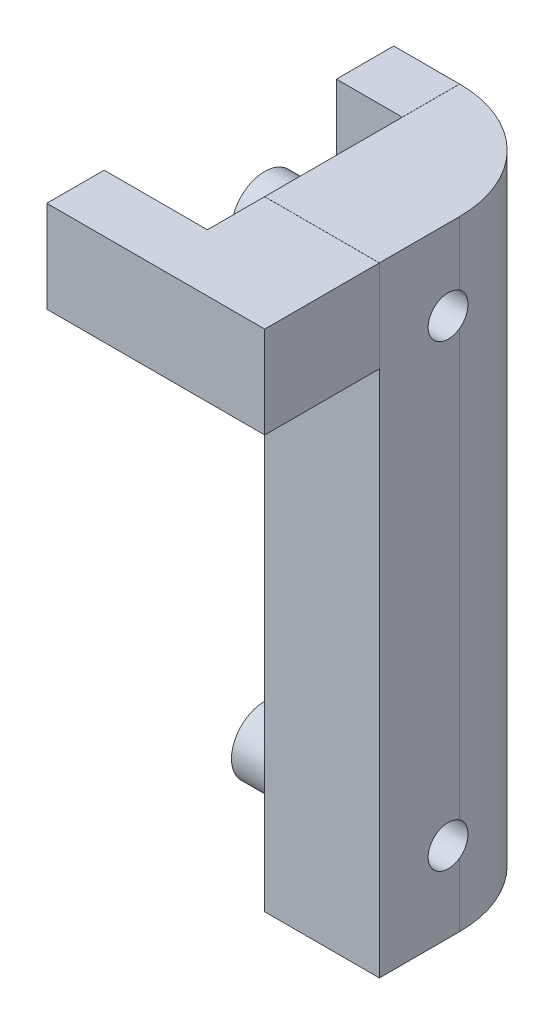
ISO-10303-21;
HEADER;
FILE_DESCRIPTION(('STEP AP214'),'2;1');
FILE_NAME('part.step','',(''),(''),'','','');
FILE_SCHEMA(('AUTOMOTIVE_DESIGN { 1 0 10303 214 1 1 1 1 }'));
ENDSEC;
DATA;
#1=APPLICATION_CONTEXT('core data for automotive mechanical design processes');
#2=APPLICATION_PROTOCOL_DEFINITION('international standard','automotive_design',2000,#1);
#3=PRODUCT_CONTEXT('',#1,'mechanical');
#4=PRODUCT('Part','Part','',(#3));
#5=PRODUCT_RELATED_PRODUCT_CATEGORY('part','',(#4));
#6=PRODUCT_DEFINITION_FORMATION('','',#4);
#7=PRODUCT_DEFINITION_CONTEXT('part definition',#1,'design');
#8=PRODUCT_DEFINITION('design','',#6,#7);
#9=PRODUCT_DEFINITION_SHAPE('','',#8);
#10=(LENGTH_UNIT() NAMED_UNIT(*) SI_UNIT(.MILLI.,.METRE.));
#11=(NAMED_UNIT(*) PLANE_ANGLE_UNIT() SI_UNIT($,.RADIAN.));
#12=(NAMED_UNIT(*) SI_UNIT($,.STERADIAN.) SOLID_ANGLE_UNIT());
#13=UNCERTAINTY_MEASURE_WITH_UNIT(LENGTH_MEASURE(1.E-05),#10,'distance_accuracy_value','');
#14=(GEOMETRIC_REPRESENTATION_CONTEXT(3) GLOBAL_UNCERTAINTY_ASSIGNED_CONTEXT((#13)) GLOBAL_UNIT_ASSIGNED_CONTEXT((#10,
#11,#12)) REPRESENTATION_CONTEXT('',''));
#15=CARTESIAN_POINT('',(0.,0.,0.));
#16=DIRECTION('',(0.,0.,1.));
#17=DIRECTION('',(1.,0.,0.));
#18=AXIS2_PLACEMENT_3D('',#15,#16,#17);
#19=CARTESIAN_POINT('',(0.,0.,-12.));
#20=DIRECTION('',(0.,0.,-1.));
#21=DIRECTION('',(-1.,0.,0.));
#22=AXIS2_PLACEMENT_3D('',#19,#20,#21);
#23=PLANE('',#22);
#24=DIRECTION('',(0.,1.,0.));
#25=VECTOR('',#24,1.);
#26=CARTESIAN_POINT('',(-5.74999999999999,0.,-12.));
#27=LINE('',#26,#25);
#28=CARTESIAN_POINT('',(-5.74999999999999,39.,-12.));
#29=VERTEX_POINT('',#28);
#30=CARTESIAN_POINT('',(-5.74999999999999,54.,-12.));
#31=VERTEX_POINT('',#30);
#32=EDGE_CURVE('E87',#29,#31,#27,.T.);
#33=ORIENTED_EDGE('',*,*,#32,.F.);
#34=DIRECTION('',(1.,0.,0.));
#35=VECTOR('',#34,1.);
#36=CARTESIAN_POINT('',(0.,39.,-12.));
#37=LINE('',#36,#35);
#38=CARTESIAN_POINT('',(-4.74999999999999,39.,-12.));
#39=VERTEX_POINT('',#38);
#40=EDGE_CURVE('E126',#29,#39,#37,.T.);
#41=ORIENTED_EDGE('',*,*,#40,.T.);
#42=DIRECTION('',(0.0843655685135238,0.996434870349984,0.));
#43=VECTOR('',#42,1.);
#44=CARTESIAN_POINT('',(-7.99471862016185,0.676892189911727,-12.));
#45=LINE('',#44,#43);
#46=CARTESIAN_POINT('',(-4.41253772594589,42.9857394813999,-12.));
#47=VERTEX_POINT('',#46);
#48=EDGE_CURVE('E154',#39,#47,#45,.T.);
#49=ORIENTED_EDGE('',*,*,#48,.T.);
#50=DIRECTION('',(1.,0.,0.));
#51=VECTOR('',#50,1.);
#52=CARTESIAN_POINT('',(0.,42.9857394813999,-12.));
#53=LINE('',#52,#51);
#54=CARTESIAN_POINT('',(-2.41253772594589,42.9857394813999,-12.));
#55=VERTEX_POINT('',#54);
#56=EDGE_CURVE('E151',#47,#55,#53,.T.);
#57=ORIENTED_EDGE('',*,*,#56,.T.);
#58=DIRECTION('',(0.259301975602914,-0.965796296041989,0.));
#59=VECTOR('',#58,1.);
#60=CARTESIAN_POINT('',(8.5147181781846,2.28607549475352,-12.));
#61=LINE('',#60,#59);
#62=CARTESIAN_POINT('',(-0.00999999999999612,34.0372460060821,-12.));
#63=VERTEX_POINT('',#62);
#64=EDGE_CURVE('E119',#55,#63,#61,.T.);
#65=ORIENTED_EDGE('',*,*,#64,.T.);
#66=DIRECTION('',(0.,-1.,0.));
#67=VECTOR('',#66,1.);
#68=CARTESIAN_POINT('',(-0.01,0.,-12.));
#69=LINE('',#68,#67);
#70=CARTESIAN_POINT('',(-0.01,54.,-12.));
#71=VERTEX_POINT('',#70);
#72=EDGE_CURVE('E49',#71,#63,#69,.T.);
#73=ORIENTED_EDGE('',*,*,#72,.F.);
#74=DIRECTION('',(1.,0.,0.));
#75=VECTOR('',#74,1.);
#76=CARTESIAN_POINT('',(10.,54.,-12.));
#77=LINE('',#76,#75);
#78=EDGE_CURVE('E101',#31,#71,#77,.T.);
#79=ORIENTED_EDGE('',*,*,#78,.F.);
#80=EDGE_LOOP('',(#33,#41,#49,#57,#65,#73,#79));
#81=FACE_BOUND('',#80,.T.);
#82=ADVANCED_FACE('F46',(#81),#23,.F.);
#83=CARTESIAN_POINT('',(0.,0.,-17.));
#84=DIRECTION('',(0.,0.,-1.));
#85=DIRECTION('',(-1.,0.,0.));
#86=AXIS2_PLACEMENT_3D('',#83,#84,#85);
#87=PLANE('',#86);
#88=DIRECTION('',(1.,0.,0.));
#89=VECTOR('',#88,1.);
#90=CARTESIAN_POINT('',(0.,39.,-17.));
#91=LINE('',#90,#89);
#92=CARTESIAN_POINT('',(-5.74999999999999,39.,-17.));
#93=VERTEX_POINT('',#92);
#94=CARTESIAN_POINT('',(-4.74999999999999,39.,-17.));
#95=VERTEX_POINT('',#94);
#96=EDGE_CURVE('E123',#93,#95,#91,.T.);
#97=ORIENTED_EDGE('',*,*,#96,.F.);
#98=DIRECTION('',(0.,1.,0.));
#99=VECTOR('',#98,1.);
#100=CARTESIAN_POINT('',(-5.74999999999999,0.,-17.));
#101=LINE('',#100,#99);
#102=CARTESIAN_POINT('',(-5.74999999999999,54.,-17.));
#103=VERTEX_POINT('',#102);
#104=EDGE_CURVE('E112',#93,#103,#101,.T.);
#105=ORIENTED_EDGE('',*,*,#104,.T.);
#106=DIRECTION('',(1.,0.,0.));
#107=VECTOR('',#106,1.);
#108=CARTESIAN_POINT('',(10.,54.,-17.));
#109=LINE('',#108,#107);
#110=CARTESIAN_POINT('',(-0.01,54.,-17.));
#111=VERTEX_POINT('',#110);
#112=EDGE_CURVE('E118',#103,#111,#109,.T.);
#113=ORIENTED_EDGE('',*,*,#112,.T.);
#114=DIRECTION('',(0.,1.,0.));
#115=VECTOR('',#114,1.);
#116=CARTESIAN_POINT('',(-0.01,0.,-17.));
#117=LINE('',#116,#115);
#118=CARTESIAN_POINT('',(-0.01,34.0372460060822,-17.));
#119=VERTEX_POINT('',#118);
#120=EDGE_CURVE('E143',#119,#111,#117,.T.);
#121=ORIENTED_EDGE('',*,*,#120,.F.);
#122=DIRECTION('',(0.259301975602914,-0.965796296041989,0.));
#123=VECTOR('',#122,1.);
#124=CARTESIAN_POINT('',(8.5147181781846,2.28607549475352,-17.));
#125=LINE('',#124,#123);
#126=CARTESIAN_POINT('',(-2.41253772594589,42.9857394813999,-17.));
#127=VERTEX_POINT('',#126);
#128=EDGE_CURVE('E12',#127,#119,#125,.T.);
#129=ORIENTED_EDGE('',*,*,#128,.F.);
#130=DIRECTION('',(1.,0.,0.));
#131=VECTOR('',#130,1.);
#132=CARTESIAN_POINT('',(0.,42.9857394813999,-17.));
#133=LINE('',#132,#131);
#134=CARTESIAN_POINT('',(-4.41253772594589,42.9857394813999,-17.));
#135=VERTEX_POINT('',#134);
#136=EDGE_CURVE('E140',#135,#127,#133,.T.);
#137=ORIENTED_EDGE('',*,*,#136,.F.);
#138=DIRECTION('',(0.0843655685135238,0.996434870349984,0.));
#139=VECTOR('',#138,1.);
#140=CARTESIAN_POINT('',(-7.99471862016185,0.676892189911727,-17.));
#141=LINE('',#140,#139);
#142=EDGE_CURVE('E132',#95,#135,#141,.T.);
#143=ORIENTED_EDGE('',*,*,#142,.F.);
#144=EDGE_LOOP('',(#97,#105,#113,#121,#129,#137,#143));
#145=FACE_BOUND('',#144,.T.);
#146=ADVANCED_FACE('F130',(#145),#87,.T.);
#147=CARTESIAN_POINT('',(10.,54.,0.));
#148=DIRECTION('',(0.,-1.,0.));
#149=DIRECTION('',(0.,0.,-1.));
#150=AXIS2_PLACEMENT_3D('',#147,#148,#149);
#151=PLANE('',#150);
#152=DIRECTION('',(0.,0.,1.));
#153=VECTOR('',#152,1.);
#154=CARTESIAN_POINT('',(-5.74999999999999,54.,-27.));
#155=LINE('',#154,#153);
#156=EDGE_CURVE('E114',#103,#31,#155,.T.);
#157=ORIENTED_EDGE('',*,*,#156,.T.);
#158=ORIENTED_EDGE('',*,*,#78,.T.);
#159=DIRECTION('',(0.,0.,1.));
#160=VECTOR('',#159,1.);
#161=CARTESIAN_POINT('',(-0.01,54.,-24.5));
#162=LINE('',#161,#160);
#163=EDGE_CURVE('E127',#111,#71,#162,.T.);
#164=ORIENTED_EDGE('',*,*,#163,.F.);
#165=ORIENTED_EDGE('',*,*,#112,.F.);
#166=EDGE_LOOP('',(#157,#158,#164,#165));
#167=FACE_BOUND('',#166,.T.);
#168=ADVANCED_FACE('F164',(#167),#151,.F.);
#169=CARTESIAN_POINT('',(-0.01,0.,-24.5));
#170=DIRECTION('',(-1.,0.,0.));
#171=DIRECTION('',(0.,-1.,0.));
#172=AXIS2_PLACEMENT_3D('',#169,#170,#171);
#173=PLANE('',#172);
#174=ORIENTED_EDGE('',*,*,#72,.T.);
#175=DIRECTION('',(0.,0.,-1.));
#176=VECTOR('',#175,1.);
#177=CARTESIAN_POINT('',(-0.01,34.0372460060822,-24.5));
#178=LINE('',#177,#176);
#179=EDGE_CURVE('E63',#63,#119,#178,.T.);
#180=ORIENTED_EDGE('',*,*,#179,.T.);
#181=ORIENTED_EDGE('',*,*,#120,.T.);
#182=ORIENTED_EDGE('',*,*,#163,.T.);
#183=EDGE_LOOP('',(#174,#180,#181,#182));
#184=FACE_BOUND('',#183,.T.);
#185=ADVANCED_FACE('F161',(#184),#173,.F.);
#186=CARTESIAN_POINT('',(-5.74999999999999,0.,-27.));
#187=DIRECTION('',(-1.,0.,0.));
#188=DIRECTION('',(0.,-1.,0.));
#189=AXIS2_PLACEMENT_3D('',#186,#187,#188);
#190=PLANE('',#189);
#191=DIRECTION('',(0.,0.,1.));
#192=VECTOR('',#191,1.);
#193=CARTESIAN_POINT('',(-5.74999999999999,39.,-27.));
#194=LINE('',#193,#192);
#195=EDGE_CURVE('E93',#93,#29,#194,.T.);
#196=ORIENTED_EDGE('',*,*,#195,.T.);
#197=ORIENTED_EDGE('',*,*,#32,.T.);
#198=ORIENTED_EDGE('',*,*,#156,.F.);
#199=ORIENTED_EDGE('',*,*,#104,.F.);
#200=EDGE_LOOP('',(#196,#197,#198,#199));
#201=FACE_BOUND('',#200,.T.);
#202=ADVANCED_FACE('F113',(#201),#190,.T.);
#203=CARTESIAN_POINT('',(0.,39.,-27.));
#204=DIRECTION('',(0.,1.,0.));
#205=DIRECTION('',(0.,0.,1.));
#206=AXIS2_PLACEMENT_3D('',#203,#204,#205);
#207=PLANE('',#206);
#208=ORIENTED_EDGE('',*,*,#96,.T.);
#209=DIRECTION('',(0.,0.,1.));
#210=VECTOR('',#209,1.);
#211=CARTESIAN_POINT('',(-4.74999999999999,39.,-27.));
#212=LINE('',#211,#210);
#213=EDGE_CURVE('E133',#95,#39,#212,.T.);
#214=ORIENTED_EDGE('',*,*,#213,.T.);
#215=ORIENTED_EDGE('',*,*,#40,.F.);
#216=ORIENTED_EDGE('',*,*,#195,.F.);
#217=EDGE_LOOP('',(#208,#214,#215,#216));
#218=FACE_BOUND('',#217,.T.);
#219=ADVANCED_FACE('F122',(#218),#207,.F.);
#220=CARTESIAN_POINT('',(-7.99471862016185,0.676892189911727,-27.));
#221=DIRECTION('',(-0.996434870349984,0.0843655685135238,0.));
#222=DIRECTION('',(-0.0843655685135238,-0.996434870349984,0.));
#223=AXIS2_PLACEMENT_3D('',#220,#221,#222);
#224=PLANE('',#223);
#225=ORIENTED_EDGE('',*,*,#142,.T.);
#226=DIRECTION('',(0.,0.,1.));
#227=VECTOR('',#226,1.);
#228=CARTESIAN_POINT('',(-4.41253772594589,42.9857394813999,-27.));
#229=LINE('',#228,#227);
#230=EDGE_CURVE('E139',#135,#47,#229,.T.);
#231=ORIENTED_EDGE('',*,*,#230,.T.);
#232=ORIENTED_EDGE('',*,*,#48,.F.);
#233=ORIENTED_EDGE('',*,*,#213,.F.);
#234=EDGE_LOOP('',(#225,#231,#232,#233));
#235=FACE_BOUND('',#234,.T.);
#236=ADVANCED_FACE('F174',(#235),#224,.F.);
#237=CARTESIAN_POINT('',(0.,42.9857394813999,-27.));
#238=DIRECTION('',(0.,1.,0.));
#239=DIRECTION('',(0.,0.,1.));
#240=AXIS2_PLACEMENT_3D('',#237,#238,#239);
#241=PLANE('',#240);
#242=ORIENTED_EDGE('',*,*,#136,.T.);
#243=DIRECTION('',(0.,0.,1.));
#244=VECTOR('',#243,1.);
#245=CARTESIAN_POINT('',(-2.41253772594589,42.9857394813999,-27.));
#246=LINE('',#245,#244);
#247=EDGE_CURVE('E55',#127,#55,#246,.T.);
#248=ORIENTED_EDGE('',*,*,#247,.T.);
#249=ORIENTED_EDGE('',*,*,#56,.F.);
#250=ORIENTED_EDGE('',*,*,#230,.F.);
#251=EDGE_LOOP('',(#242,#248,#249,#250));
#252=FACE_BOUND('',#251,.T.);
#253=ADVANCED_FACE('F171',(#252),#241,.F.);
#254=CARTESIAN_POINT('',(8.5147181781846,2.28607549475352,-27.));
#255=DIRECTION('',(0.965796296041989,0.259301975602914,0.));
#256=DIRECTION('',(-0.259301975602914,0.965796296041989,0.));
#257=AXIS2_PLACEMENT_3D('',#254,#255,#256);
#258=PLANE('',#257);
#259=ORIENTED_EDGE('',*,*,#128,.T.);
#260=ORIENTED_EDGE('',*,*,#179,.F.);
#261=ORIENTED_EDGE('',*,*,#64,.F.);
#262=ORIENTED_EDGE('',*,*,#247,.F.);
#263=EDGE_LOOP('',(#259,#260,#261,#262));
#264=FACE_BOUND('',#263,.T.);
#265=ADVANCED_FACE('F168',(#264),#258,.F.);
#266=CLOSED_SHELL('',(#82,#146,#168,#185,#202,#219,#236,#253,#265));
#267=MANIFOLD_SOLID_BREP('B2',#266);
#268=CARTESIAN_POINT('',(-6.,0.,3.));
#269=DIRECTION('',(-1.,0.,0.));
#270=DIRECTION('',(0.,0.,1.));
#271=AXIS2_PLACEMENT_3D('',#268,#269,#270);
#272=PLANE('',#271);
#273=CARTESIAN_POINT('',(-6.,47.,-6.));
#274=DIRECTION('',(-1.,0.,0.));
#275=DIRECTION('',(0.,0.,1.));
#276=AXIS2_PLACEMENT_3D('',#273,#274,#275);
#277=CIRCLE('',#276,1.75);
#278=CARTESIAN_POINT('',(-6.,47.,-4.25));
#279=VERTEX_POINT('',#278);
#280=EDGE_CURVE('E439',#279,#279,#277,.F.);
#281=ORIENTED_EDGE('',*,*,#280,.T.);
#282=EDGE_LOOP('',(#281));
#283=FACE_BOUND('',#282,.T.);
#284=CARTESIAN_POINT('',(-6.,47.,-6.));
#285=DIRECTION('',(-1.,0.,0.));
#286=DIRECTION('',(0.,0.,1.));
#287=AXIS2_PLACEMENT_3D('',#284,#285,#286);
#288=CIRCLE('',#287,2.9);
#289=CARTESIAN_POINT('',(-6.,47.,-3.1));
#290=VERTEX_POINT('',#289);
#291=EDGE_CURVE('E389',#290,#290,#288,.T.);
#292=ORIENTED_EDGE('',*,*,#291,.T.);
#293=EDGE_LOOP('',(#292));
#294=FACE_BOUND('',#293,.T.);
#295=ADVANCED_FACE('F273',(#283,#294),#272,.T.);
#296=CARTESIAN_POINT('',(-6.,7.,-6.));
#297=DIRECTION('',(-1.,0.,0.));
#298=DIRECTION('',(0.,0.,1.));
#299=AXIS2_PLACEMENT_3D('',#296,#297,#298);
#300=CIRCLE('',#299,1.75);
#301=CARTESIAN_POINT('',(-6.,7.,-4.25));
#302=VERTEX_POINT('',#301);
#303=EDGE_CURVE('E443',#302,#302,#300,.F.);
#304=ORIENTED_EDGE('',*,*,#303,.T.);
#305=EDGE_LOOP('',(#304));
#306=FACE_BOUND('',#305,.T.);
#307=CARTESIAN_POINT('',(-6.,7.,-6.));
#308=DIRECTION('',(-1.,0.,0.));
#309=DIRECTION('',(0.,0.,1.));
#310=AXIS2_PLACEMENT_3D('',#307,#308,#309);
#311=CIRCLE('',#310,2.9);
#312=CARTESIAN_POINT('',(-6.,7.,-3.1));
#313=VERTEX_POINT('',#312);
#314=EDGE_CURVE('E395',#313,#313,#311,.T.);
#315=ORIENTED_EDGE('',*,*,#314,.T.);
#316=EDGE_LOOP('',(#315));
#317=FACE_BOUND('',#316,.T.);
#318=ADVANCED_FACE('F421',(#306,#317),#272,.T.);
#319=CARTESIAN_POINT('',(-18.,47.,-6.));
#320=DIRECTION('',(1.,0.,0.));
#321=DIRECTION('',(0.,0.,-1.));
#322=AXIS2_PLACEMENT_3D('',#319,#320,#321);
#323=CYLINDRICAL_SURFACE('',#322,2.9);
#324=CARTESIAN_POINT('',(0.,47.,-6.));
#325=DIRECTION('',(-1.,0.,0.));
#326=DIRECTION('',(0.,0.,1.));
#327=AXIS2_PLACEMENT_3D('',#324,#325,#326);
#328=CIRCLE('',#327,2.9);
#329=CARTESIAN_POINT('',(0.,47.,-3.1));
#330=VERTEX_POINT('',#329);
#331=EDGE_CURVE('E385',#330,#330,#328,.T.);
#332=ORIENTED_EDGE('',*,*,#331,.T.);
#333=EDGE_LOOP('',(#332));
#334=FACE_BOUND('',#333,.T.);
#335=ORIENTED_EDGE('',*,*,#291,.F.);
#336=EDGE_LOOP('',(#335));
#337=FACE_BOUND('',#336,.T.);
#338=ADVANCED_FACE('F418',(#334,#337),#323,.T.);
#339=CARTESIAN_POINT('',(-18.,7.,-6.));
#340=DIRECTION('',(1.,0.,0.));
#341=DIRECTION('',(0.,0.,-1.));
#342=AXIS2_PLACEMENT_3D('',#339,#340,#341);
#343=CYLINDRICAL_SURFACE('',#342,2.9);
#344=CARTESIAN_POINT('',(0.,7.,-6.));
#345=DIRECTION('',(-1.,0.,0.));
#346=DIRECTION('',(0.,0.,1.));
#347=AXIS2_PLACEMENT_3D('',#344,#345,#346);
#348=CIRCLE('',#347,2.9);
#349=CARTESIAN_POINT('',(0.,7.,-3.1));
#350=VERTEX_POINT('',#349);
#351=EDGE_CURVE('E381',#350,#350,#348,.T.);
#352=ORIENTED_EDGE('',*,*,#351,.T.);
#353=EDGE_LOOP('',(#352));
#354=FACE_BOUND('',#353,.T.);
#355=ORIENTED_EDGE('',*,*,#314,.F.);
#356=EDGE_LOOP('',(#355));
#357=FACE_BOUND('',#356,.T.);
#358=ADVANCED_FACE('F410',(#354,#357),#343,.T.);
#359=CARTESIAN_POINT('',(-40.,47.,-6.));
#360=DIRECTION('',(1.,0.,0.));
#361=DIRECTION('',(0.,0.,-1.));
#362=AXIS2_PLACEMENT_3D('',#359,#360,#361);
#363=CYLINDRICAL_SURFACE('',#362,1.75);
#364=CARTESIAN_POINT('',(10.,47.,-6.));
#365=DIRECTION('',(1.,0.,0.));
#366=DIRECTION('',(0.,0.,-1.));
#367=AXIS2_PLACEMENT_3D('',#364,#365,#366);
#368=CIRCLE('',#367,1.75);
#369=CARTESIAN_POINT('',(10.,48.4361406616345,-7.));
#370=VERTEX_POINT('',#369);
#371=CARTESIAN_POINT('',(10.,45.5638593383655,-7.));
#372=VERTEX_POINT('',#371);
#373=EDGE_CURVE('E378',#370,#372,#368,.T.);
#374=ORIENTED_EDGE('',*,*,#373,.T.);
#375=CARTESIAN_POINT('',(10.,45.5638593383655,-7.));
#376=CARTESIAN_POINT('',(10.0000006542808,45.5919650566019,-7.04036344551534));
#377=CARTESIAN_POINT('',(9.99975552912993,45.6217592461802,-7.07952147261429));
#378=CARTESIAN_POINT('',(9.99886721788507,45.6845302019363,-7.15518733666776));
#379=CARTESIAN_POINT('',(9.99822406551166,45.7175066983116,-7.19169539783292));
#380=CARTESIAN_POINT('',(9.99584030617024,45.820813513358,-7.29678148084108));
#381=CARTESIAN_POINT('',(9.99364478898106,45.8956139153034,-7.36105431872777));
#382=CARTESIAN_POINT('',(9.98882544239522,46.054906829154,-7.47613351277805));
#383=CARTESIAN_POINT('',(9.98620147105636,46.1394025502455,-7.52693539147472));
#384=CARTESIAN_POINT('',(9.98124809723654,46.3157152869494,-7.61365995107846));
#385=CARTESIAN_POINT('',(9.97891863903286,46.4075309122384,-7.64958544957473));
#386=CARTESIAN_POINT('',(9.97511636825516,46.5960599022418,-7.7055850033634));
#387=CARTESIAN_POINT('',(9.97364500693632,46.6927812652959,-7.72563222492341));
#388=CARTESIAN_POINT('',(9.97190260333323,46.8882438337843,-7.74920014978107));
#389=CARTESIAN_POINT('',(9.97163173501098,46.9869853298711,-7.75271845789818));
#390=CARTESIAN_POINT('',(9.97235055566954,47.1833831704782,-7.74313260307863));
#391=CARTESIAN_POINT('',(9.97333683064026,47.2810417305433,-7.73007345973699));
#392=CARTESIAN_POINT('',(9.9763417454006,47.4727742133054,-7.68778574199415));
#393=CARTESIAN_POINT('',(9.97836035839059,47.5668482289894,-7.65855758734069));
#394=CARTESIAN_POINT('',(9.98295739974431,47.7488299782278,-7.58474179248768));
#395=CARTESIAN_POINT('',(9.98553628681202,47.8367325806732,-7.54014154929976));
#396=CARTESIAN_POINT('',(9.99058725724228,48.0038095791689,-7.43683755119579));
#397=CARTESIAN_POINT('',(9.99305938180665,48.082987360944,-7.37813929542403));
#398=CARTESIAN_POINT('',(9.99654582384383,48.2093309081838,-7.2668664717303));
#399=CARTESIAN_POINT('',(9.99777482009432,48.2591883227644,-7.21731558560462));
#400=CARTESIAN_POINT('',(9.9995029589419,48.3525603899018,-7.11265622577304));
#401=CARTESIAN_POINT('',(10.0000029676914,48.396082514322,-7.05755443082301));
#402=CARTESIAN_POINT('',(10.,48.4361406616345,-7.));
#403=B_SPLINE_CURVE_WITH_KNOTS('',3,(#375,#376,#377,#378,#379,#380,#381,#382,#383,#384,#385,
#386,#387,#388,#389,#390,#391,#392,#393,#394,#395,#396,#397,#398,#399,#400,#401,#402),
.UNSPECIFIED.,.F.,.F.,(4,2,2,2,2,2,2,2,2,2,2,2,2,4),(0.,0.147461941238161,0.294911391308664,
0.589330258085857,0.883846861260627,1.17830765739356,1.4732650264693,1.76826513606561,
2.06246582135381,2.35665886954673,2.6510936913996,2.94541385046185,3.15584019967012,
3.36601632476801),.UNSPECIFIED.);
#404=EDGE_CURVE('E373',#372,#370,#403,.T.);
#405=ORIENTED_EDGE('',*,*,#404,.T.);
#406=EDGE_LOOP('',(#374,#405));
#407=FACE_BOUND('',#406,.T.);
#408=ORIENTED_EDGE('',*,*,#280,.F.);
#409=EDGE_LOOP('',(#408));
#410=FACE_BOUND('',#409,.T.);
#411=ADVANCED_FACE('F405',(#407,#410),#363,.F.);
#412=CARTESIAN_POINT('',(-40.,7.,-6.));
#413=DIRECTION('',(1.,0.,0.));
#414=DIRECTION('',(0.,0.,-1.));
#415=AXIS2_PLACEMENT_3D('',#412,#413,#414);
#416=CYLINDRICAL_SURFACE('',#415,1.75);
#417=CARTESIAN_POINT('',(10.,7.,-6.));
#418=DIRECTION('',(1.,0.,0.));
#419=DIRECTION('',(0.,0.,-1.));
#420=AXIS2_PLACEMENT_3D('',#417,#418,#419);
#421=CIRCLE('',#420,1.75);
#422=CARTESIAN_POINT('',(10.,8.43614066163451,-7.));
#423=VERTEX_POINT('',#422);
#424=CARTESIAN_POINT('',(10.,5.56385933836549,-7.));
#425=VERTEX_POINT('',#424);
#426=EDGE_CURVE('E383',#423,#425,#421,.T.);
#427=ORIENTED_EDGE('',*,*,#426,.T.);
#428=CARTESIAN_POINT('',(10.,5.56385933836549,-7.));
#429=CARTESIAN_POINT('',(10.0000006542808,5.59196505660189,-7.04036344551534));
#430=CARTESIAN_POINT('',(9.99975552912993,5.62175924618019,-7.07952147261429));
#431=CARTESIAN_POINT('',(9.99886721788507,5.68453020193636,-7.15518733666776));
#432=CARTESIAN_POINT('',(9.99822406551166,5.71750669831157,-7.19169539783292));
#433=CARTESIAN_POINT('',(9.99584030617024,5.82081351335797,-7.29678148084108));
#434=CARTESIAN_POINT('',(9.99364478898106,5.89561391530344,-7.36105431872777));
#435=CARTESIAN_POINT('',(9.98882544239522,6.05490682915403,-7.47613351277805));
#436=CARTESIAN_POINT('',(9.98620147105636,6.13940255024554,-7.52693539147472));
#437=CARTESIAN_POINT('',(9.98124809723654,6.31571528694942,-7.61365995107846));
#438=CARTESIAN_POINT('',(9.97891863903286,6.40753091223844,-7.64958544957473));
#439=CARTESIAN_POINT('',(9.97511636825516,6.59605990224182,-7.7055850033634));
#440=CARTESIAN_POINT('',(9.97364500693632,6.69278126529587,-7.72563222492341));
#441=CARTESIAN_POINT('',(9.97190260333323,6.88824383378427,-7.74920014978107));
#442=CARTESIAN_POINT('',(9.97163173501098,6.98698532987111,-7.75271845789817));
#443=CARTESIAN_POINT('',(9.97235055566953,7.18338317047819,-7.74313260307863));
#444=CARTESIAN_POINT('',(9.97333683064026,7.28104173054331,-7.73007345973699));
#445=CARTESIAN_POINT('',(9.9763417454006,7.47277421330537,-7.68778574199415));
#446=CARTESIAN_POINT('',(9.9783603583906,7.56684822898936,-7.65855758734069));
#447=CARTESIAN_POINT('',(9.98295739974431,7.74882997822776,-7.58474179248768));
#448=CARTESIAN_POINT('',(9.98553628681202,7.83673258067322,-7.54014154929976));
#449=CARTESIAN_POINT('',(9.99058725724228,8.00380957916886,-7.43683755119579));
#450=CARTESIAN_POINT('',(9.99305938180665,8.08298736094404,-7.37813929542403));
#451=CARTESIAN_POINT('',(9.99654582384383,8.20933090818378,-7.2668664717303));
#452=CARTESIAN_POINT('',(9.99777482009432,8.25918832276443,-7.21731558560462));
#453=CARTESIAN_POINT('',(9.9995029589419,8.35256038990176,-7.11265622577305));
#454=CARTESIAN_POINT('',(10.0000029676914,8.39608251432201,-7.05755443082301));
#455=CARTESIAN_POINT('',(10.,8.43614066163451,-7.));
#456=B_SPLINE_CURVE_WITH_KNOTS('',3,(#428,#429,#430,#431,#432,#433,#434,#435,#436,#437,#438,
#439,#440,#441,#442,#443,#444,#445,#446,#447,#448,#449,#450,#451,#452,#453,#454,#455),
.UNSPECIFIED.,.F.,.F.,(4,2,2,2,2,2,2,2,2,2,2,2,2,4),(0.,0.147461941238167,0.294911391308668,
0.589330258085854,0.883846861260628,1.17830765739354,1.4732650264693,1.7682651360656,
2.06246582135381,2.35665886954672,2.65109369139959,2.94541385046184,3.15584019967011,
3.36601632476801),.UNSPECIFIED.);
#457=EDGE_CURVE('E331',#425,#423,#456,.T.);
#458=ORIENTED_EDGE('',*,*,#457,.T.);
#459=EDGE_LOOP('',(#427,#458));
#460=FACE_BOUND('',#459,.T.);
#461=ORIENTED_EDGE('',*,*,#303,.F.);
#462=EDGE_LOOP('',(#461));
#463=FACE_BOUND('',#462,.T.);
#464=ADVANCED_FACE('F409',(#460,#463),#416,.F.);
#465=CARTESIAN_POINT('',(0.,0.,-7.));
#466=DIRECTION('',(0.,1.,0.));
#467=DIRECTION('',(0.,0.,1.));
#468=AXIS2_PLACEMENT_3D('',#465,#466,#467);
#469=CYLINDRICAL_SURFACE('',#468,10.);
#470=ORIENTED_EDGE('',*,*,#457,.F.);
#471=DIRECTION('',(0.,-1.,0.));
#472=VECTOR('',#471,1.);
#473=CARTESIAN_POINT('',(10.,54.,-7.));
#474=LINE('',#473,#472);
#475=CARTESIAN_POINT('',(10.,0.,-7.));
#476=VERTEX_POINT('',#475);
#477=EDGE_CURVE('E346',#476,#425,#474,.F.);
#478=ORIENTED_EDGE('',*,*,#477,.F.);
#479=CARTESIAN_POINT('',(0.,0.,-7.));
#480=DIRECTION('',(0.,1.,0.));
#481=DIRECTION('',(0.,0.,1.));
#482=AXIS2_PLACEMENT_3D('',#479,#480,#481);
#483=CIRCLE('',#482,10.);
#484=CARTESIAN_POINT('',(0.,0.,-17.));
#485=VERTEX_POINT('',#484);
#486=EDGE_CURVE('E327',#485,#476,#483,.F.);
#487=ORIENTED_EDGE('',*,*,#486,.F.);
#488=DIRECTION('',(0.,-1.,0.));
#489=VECTOR('',#488,1.);
#490=CARTESIAN_POINT('',(0.,0.,-17.));
#491=LINE('',#490,#489);
#492=CARTESIAN_POINT('',(0.,54.,-17.));
#493=VERTEX_POINT('',#492);
#494=EDGE_CURVE('E334',#493,#485,#491,.T.);
#495=ORIENTED_EDGE('',*,*,#494,.F.);
#496=CARTESIAN_POINT('',(0.,54.,-7.));
#497=DIRECTION('',(0.,-1.,0.));
#498=DIRECTION('',(0.,0.,-1.));
#499=AXIS2_PLACEMENT_3D('',#496,#497,#498);
#500=CIRCLE('',#499,10.);
#501=CARTESIAN_POINT('',(10.,54.,-7.));
#502=VERTEX_POINT('',#501);
#503=EDGE_CURVE('E44',#502,#493,#500,.F.);
#504=ORIENTED_EDGE('',*,*,#503,.F.);
#505=DIRECTION('',(0.,-1.,0.));
#506=VECTOR('',#505,1.);
#507=CARTESIAN_POINT('',(10.,54.,-7.));
#508=LINE('',#507,#506);
#509=EDGE_CURVE('E341',#370,#502,#508,.F.);
#510=ORIENTED_EDGE('',*,*,#509,.F.);
#511=ORIENTED_EDGE('',*,*,#404,.F.);
#512=DIRECTION('',(0.,-1.,0.));
#513=VECTOR('',#512,1.);
#514=CARTESIAN_POINT('',(10.,54.,-7.));
#515=LINE('',#514,#513);
#516=EDGE_CURVE('E360',#423,#372,#515,.F.);
#517=ORIENTED_EDGE('',*,*,#516,.F.);
#518=EDGE_LOOP('',(#470,#478,#487,#495,#504,#510,#511,#517));
#519=FACE_BOUND('',#518,.T.);
#520=ADVANCED_FACE('F345',(#519),#469,.T.);
#521=CARTESIAN_POINT('',(10.,0.,0.));
#522=DIRECTION('',(0.,1.,0.));
#523=DIRECTION('',(0.,0.,1.));
#524=AXIS2_PLACEMENT_3D('',#521,#522,#523);
#525=PLANE('',#524);
#526=DIRECTION('',(0.,0.,-1.));
#527=VECTOR('',#526,1.);
#528=CARTESIAN_POINT('',(0.,0.,0.));
#529=LINE('',#528,#527);
#530=CARTESIAN_POINT('',(0.,0.,0.));
#531=VERTEX_POINT('',#530);
#532=EDGE_CURVE('E322',#531,#485,#529,.T.);
#533=ORIENTED_EDGE('',*,*,#532,.T.);
#534=ORIENTED_EDGE('',*,*,#486,.T.);
#535=DIRECTION('',(0.,0.,-1.));
#536=VECTOR('',#535,1.);
#537=CARTESIAN_POINT('',(10.,0.,0.));
#538=LINE('',#537,#536);
#539=CARTESIAN_POINT('',(10.,0.,0.));
#540=VERTEX_POINT('',#539);
#541=EDGE_CURVE('E363',#540,#476,#538,.T.);
#542=ORIENTED_EDGE('',*,*,#541,.F.);
#543=DIRECTION('',(-1.,0.,0.));
#544=VECTOR('',#543,1.);
#545=CARTESIAN_POINT('',(10.,0.,0.));
#546=LINE('',#545,#544);
#547=EDGE_CURVE('E330',#540,#531,#546,.T.);
#548=ORIENTED_EDGE('',*,*,#547,.T.);
#549=EDGE_LOOP('',(#533,#534,#542,#548));
#550=FACE_BOUND('',#549,.T.);
#551=ADVANCED_FACE('F324',(#550),#525,.F.);
#552=CARTESIAN_POINT('',(10.,0.,0.));
#553=DIRECTION('',(0.,0.,-1.));
#554=DIRECTION('',(-1.,0.,0.));
#555=AXIS2_PLACEMENT_3D('',#552,#553,#554);
#556=PLANE('',#555);
#557=ORIENTED_EDGE('',*,*,#547,.F.);
#558=DIRECTION('',(0.,-1.,0.));
#559=VECTOR('',#558,1.);
#560=CARTESIAN_POINT('',(10.,96.,0.));
#561=LINE('',#560,#559);
#562=CARTESIAN_POINT('',(10.,54.,0.));
#563=VERTEX_POINT('',#562);
#564=EDGE_CURVE('E367',#563,#540,#561,.T.);
#565=ORIENTED_EDGE('',*,*,#564,.F.);
#566=DIRECTION('',(1.,0.,0.));
#567=VECTOR('',#566,1.);
#568=CARTESIAN_POINT('',(10.,54.,0.));
#569=LINE('',#568,#567);
#570=CARTESIAN_POINT('',(0.,54.,0.));
#571=VERTEX_POINT('',#570);
#572=EDGE_CURVE('E364',#571,#563,#569,.T.);
#573=ORIENTED_EDGE('',*,*,#572,.F.);
#574=DIRECTION('',(0.,-1.,0.));
#575=VECTOR('',#574,1.);
#576=CARTESIAN_POINT('',(0.,0.,0.));
#577=LINE('',#576,#575);
#578=EDGE_CURVE('E289',#571,#531,#577,.T.);
#579=ORIENTED_EDGE('',*,*,#578,.T.);
#580=EDGE_LOOP('',(#557,#565,#573,#579));
#581=FACE_BOUND('',#580,.T.);
#582=ADVANCED_FACE('F423',(#581),#556,.F.);
#583=CARTESIAN_POINT('',(10.,46.,0.));
#584=DIRECTION('',(1.,0.,0.));
#585=DIRECTION('',(0.,0.,-1.));
#586=AXIS2_PLACEMENT_3D('',#583,#584,#585);
#587=PLANE('',#586);
#588=ORIENTED_EDGE('',*,*,#564,.T.);
#589=ORIENTED_EDGE('',*,*,#541,.T.);
#590=ORIENTED_EDGE('',*,*,#477,.T.);
#591=ORIENTED_EDGE('',*,*,#426,.F.);
#592=ORIENTED_EDGE('',*,*,#516,.T.);
#593=ORIENTED_EDGE('',*,*,#373,.F.);
#594=ORIENTED_EDGE('',*,*,#509,.T.);
#595=DIRECTION('',(0.,0.,-1.));
#596=VECTOR('',#595,1.);
#597=CARTESIAN_POINT('',(10.,54.,0.));
#598=LINE('',#597,#596);
#599=EDGE_CURVE('E277',#563,#502,#598,.T.);
#600=ORIENTED_EDGE('',*,*,#599,.F.);
#601=EDGE_LOOP('',(#588,#589,#590,#591,#592,#593,#594,#600));
#602=FACE_BOUND('',#601,.T.);
#603=ADVANCED_FACE('F376',(#602),#587,.T.);
#604=CARTESIAN_POINT('',(0.,46.,5.));
#605=DIRECTION('',(-1.,0.,0.));
#606=DIRECTION('',(0.,0.,1.));
#607=AXIS2_PLACEMENT_3D('',#604,#605,#606);
#608=PLANE('',#607);
#609=ORIENTED_EDGE('',*,*,#578,.F.);
#610=DIRECTION('',(0.,0.,1.));
#611=VECTOR('',#610,1.);
#612=CARTESIAN_POINT('',(0.,54.,5.));
#613=LINE('',#612,#611);
#614=EDGE_CURVE('E338',#493,#571,#613,.T.);
#615=ORIENTED_EDGE('',*,*,#614,.F.);
#616=ORIENTED_EDGE('',*,*,#494,.T.);
#617=ORIENTED_EDGE('',*,*,#532,.F.);
#618=EDGE_LOOP('',(#609,#615,#616,#617));
#619=FACE_BOUND('',#618,.T.);
#620=ORIENTED_EDGE('',*,*,#351,.F.);
#621=EDGE_LOOP('',(#620));
#622=FACE_BOUND('',#621,.T.);
#623=ORIENTED_EDGE('',*,*,#331,.F.);
#624=EDGE_LOOP('',(#623));
#625=FACE_BOUND('',#624,.T.);
#626=ADVANCED_FACE('F335',(#619,#622,#625),#608,.T.);
#627=CARTESIAN_POINT('',(10.,54.,0.));
#628=DIRECTION('',(0.,-1.,0.));
#629=DIRECTION('',(0.,0.,-1.));
#630=AXIS2_PLACEMENT_3D('',#627,#628,#629);
#631=PLANE('',#630);
#632=ORIENTED_EDGE('',*,*,#614,.T.);
#633=ORIENTED_EDGE('',*,*,#572,.T.);
#634=ORIENTED_EDGE('',*,*,#599,.T.);
#635=ORIENTED_EDGE('',*,*,#503,.T.);
#636=EDGE_LOOP('',(#632,#633,#634,#635));
#637=FACE_BOUND('',#636,.T.);
#638=ADVANCED_FACE('F275',(#637),#631,.F.);
#639=CLOSED_SHELL('',(#295,#318,#338,#358,#411,#464,#520,#551,#582,#603,#626,#638));
#640=MANIFOLD_SOLID_BREP('B6',#639);
#641=CARTESIAN_POINT('',(-18.,46.,5.));
#642=DIRECTION('',(0.,0.,-1.));
#643=DIRECTION('',(-1.,0.,0.));
#644=AXIS2_PLACEMENT_3D('',#641,#642,#643);
#645=PLANE('',#644);
#646=DIRECTION('',(0.,-1.,0.));
#647=VECTOR('',#646,1.);
#648=CARTESIAN_POINT('',(-9.,46.,5.));
#649=LINE('',#648,#647);
#650=CARTESIAN_POINT('',(-9.,54.,5.));
#651=VERTEX_POINT('',#650);
#652=CARTESIAN_POINT('',(-9.,46.,5.));
#653=VERTEX_POINT('',#652);
#654=EDGE_CURVE('E626',#651,#653,#649,.T.);
#655=ORIENTED_EDGE('',*,*,#654,.F.);
#656=DIRECTION('',(-1.,0.,0.));
#657=VECTOR('',#656,1.);
#658=CARTESIAN_POINT('',(-18.,54.,5.));
#659=LINE('',#658,#657);
#660=CARTESIAN_POINT('',(0.,54.,5.));
#661=VERTEX_POINT('',#660);
#662=EDGE_CURVE('E638',#661,#651,#659,.T.);
#663=ORIENTED_EDGE('',*,*,#662,.F.);
#664=DIRECTION('',(0.,1.,0.));
#665=VECTOR('',#664,1.);
#666=CARTESIAN_POINT('',(0.,46.,5.));
#667=LINE('',#666,#665);
#668=CARTESIAN_POINT('',(0.,46.,5.));
#669=VERTEX_POINT('',#668);
#670=EDGE_CURVE('E580',#669,#661,#667,.T.);
#671=ORIENTED_EDGE('',*,*,#670,.F.);
#672=DIRECTION('',(-1.,0.,0.));
#673=VECTOR('',#672,1.);
#674=CARTESIAN_POINT('',(-18.,46.,5.));
#675=LINE('',#674,#673);
#676=EDGE_CURVE('E640',#669,#653,#675,.T.);
#677=ORIENTED_EDGE('',*,*,#676,.T.);
#678=EDGE_LOOP('',(#655,#663,#671,#677));
#679=FACE_BOUND('',#678,.T.);
#680=ADVANCED_FACE('F571',(#679),#645,.T.);
#681=CARTESIAN_POINT('',(10.,46.,10.));
#682=DIRECTION('',(0.,0.,1.));
#683=DIRECTION('',(1.,0.,0.));
#684=AXIS2_PLACEMENT_3D('',#681,#682,#683);
#685=PLANE('',#684);
#686=DIRECTION('',(0.,1.,0.));
#687=VECTOR('',#686,1.);
#688=CARTESIAN_POINT('',(-8.99999999999999,46.,10.));
#689=LINE('',#688,#687);
#690=CARTESIAN_POINT('',(-9.,46.,10.));
#691=VERTEX_POINT('',#690);
#692=CARTESIAN_POINT('',(-8.99999999999999,54.,10.));
#693=VERTEX_POINT('',#692);
#694=EDGE_CURVE('E588',#691,#693,#689,.T.);
#695=ORIENTED_EDGE('',*,*,#694,.F.);
#696=DIRECTION('',(1.,0.,0.));
#697=VECTOR('',#696,1.);
#698=CARTESIAN_POINT('',(10.,46.,10.));
#699=LINE('',#698,#697);
#700=CARTESIAN_POINT('',(10.,46.,10.));
#701=VERTEX_POINT('',#700);
#702=EDGE_CURVE('E647',#691,#701,#699,.T.);
#703=ORIENTED_EDGE('',*,*,#702,.T.);
#704=DIRECTION('',(0.,1.,0.));
#705=VECTOR('',#704,1.);
#706=CARTESIAN_POINT('',(10.,46.,10.));
#707=LINE('',#706,#705);
#708=CARTESIAN_POINT('',(10.,54.,10.));
#709=VERTEX_POINT('',#708);
#710=EDGE_CURVE('E575',#701,#709,#707,.T.);
#711=ORIENTED_EDGE('',*,*,#710,.T.);
#712=DIRECTION('',(1.,0.,0.));
#713=VECTOR('',#712,1.);
#714=CARTESIAN_POINT('',(10.,54.,10.));
#715=LINE('',#714,#713);
#716=EDGE_CURVE('E664',#693,#709,#715,.T.);
#717=ORIENTED_EDGE('',*,*,#716,.F.);
#718=EDGE_LOOP('',(#695,#703,#711,#717));
#719=FACE_BOUND('',#718,.T.);
#720=ADVANCED_FACE('F698',(#719),#685,.T.);
#721=CARTESIAN_POINT('',(0.,46.,0.));
#722=DIRECTION('',(0.,-1.,0.));
#723=DIRECTION('',(0.,0.,-1.));
#724=AXIS2_PLACEMENT_3D('',#721,#722,#723);
#725=PLANE('',#724);
#726=DIRECTION('',(0.,0.,1.));
#727=VECTOR('',#726,1.);
#728=CARTESIAN_POINT('',(-9.,46.,0.));
#729=LINE('',#728,#727);
#730=EDGE_CURVE('E631',#653,#691,#729,.T.);
#731=ORIENTED_EDGE('',*,*,#730,.F.);
#732=ORIENTED_EDGE('',*,*,#676,.F.);
#733=DIRECTION('',(0.,0.,1.));
#734=VECTOR('',#733,1.);
#735=CARTESIAN_POINT('',(0.,46.,5.));
#736=LINE('',#735,#734);
#737=CARTESIAN_POINT('',(0.,46.,0.00999999999999872));
#738=VERTEX_POINT('',#737);
#739=EDGE_CURVE('E659',#738,#669,#736,.T.);
#740=ORIENTED_EDGE('',*,*,#739,.F.);
#741=DIRECTION('',(-1.,0.,0.));
#742=VECTOR('',#741,1.);
#743=CARTESIAN_POINT('',(10.,46.,0.00999999999999992));
#744=LINE('',#743,#742);
#745=CARTESIAN_POINT('',(10.,46.,0.00999999999999764));
#746=VERTEX_POINT('',#745);
#747=EDGE_CURVE('E641',#746,#738,#744,.T.);
#748=ORIENTED_EDGE('',*,*,#747,.F.);
#749=DIRECTION('',(0.,0.,-1.));
#750=VECTOR('',#749,1.);
#751=CARTESIAN_POINT('',(10.,46.,0.));
#752=LINE('',#751,#750);
#753=EDGE_CURVE('E649',#701,#746,#752,.T.);
#754=ORIENTED_EDGE('',*,*,#753,.F.);
#755=ORIENTED_EDGE('',*,*,#702,.F.);
#756=EDGE_LOOP('',(#731,#732,#740,#748,#754,#755));
#757=FACE_BOUND('',#756,.T.);
#758=ADVANCED_FACE('F703',(#757),#725,.T.);
#759=CARTESIAN_POINT('',(10.,46.,0.));
#760=DIRECTION('',(1.,0.,0.));
#761=DIRECTION('',(0.,0.,-1.));
#762=AXIS2_PLACEMENT_3D('',#759,#760,#761);
#763=PLANE('',#762);
#764=DIRECTION('',(0.,-1.,0.));
#765=VECTOR('',#764,1.);
#766=CARTESIAN_POINT('',(10.,96.,0.00999999999999992));
#767=LINE('',#766,#765);
#768=CARTESIAN_POINT('',(10.,54.,0.00999999999999992));
#769=VERTEX_POINT('',#768);
#770=EDGE_CURVE('E596',#769,#746,#767,.T.);
#771=ORIENTED_EDGE('',*,*,#770,.F.);
#772=DIRECTION('',(0.,0.,-1.));
#773=VECTOR('',#772,1.);
#774=CARTESIAN_POINT('',(10.,54.,0.));
#775=LINE('',#774,#773);
#776=EDGE_CURVE('E651',#709,#769,#775,.T.);
#777=ORIENTED_EDGE('',*,*,#776,.F.);
#778=ORIENTED_EDGE('',*,*,#710,.F.);
#779=ORIENTED_EDGE('',*,*,#753,.T.);
#780=EDGE_LOOP('',(#771,#777,#778,#779));
#781=FACE_BOUND('',#780,.T.);
#782=ADVANCED_FACE('F668',(#781),#763,.T.);
#783=CARTESIAN_POINT('',(0.,46.,5.));
#784=DIRECTION('',(-1.,0.,0.));
#785=DIRECTION('',(0.,0.,1.));
#786=AXIS2_PLACEMENT_3D('',#783,#784,#785);
#787=PLANE('',#786);
#788=DIRECTION('',(0.,1.,0.));
#789=VECTOR('',#788,1.);
#790=CARTESIAN_POINT('',(0.,46.,0.00999999999999873));
#791=LINE('',#790,#789);
#792=CARTESIAN_POINT('',(0.,54.,0.00999999999999873));
#793=VERTEX_POINT('',#792);
#794=EDGE_CURVE('E671',#738,#793,#791,.T.);
#795=ORIENTED_EDGE('',*,*,#794,.F.);
#796=ORIENTED_EDGE('',*,*,#739,.T.);
#797=ORIENTED_EDGE('',*,*,#670,.T.);
#798=DIRECTION('',(0.,0.,1.));
#799=VECTOR('',#798,1.);
#800=CARTESIAN_POINT('',(0.,54.,5.));
#801=LINE('',#800,#799);
#802=EDGE_CURVE('E645',#793,#661,#801,.T.);
#803=ORIENTED_EDGE('',*,*,#802,.F.);
#804=EDGE_LOOP('',(#795,#796,#797,#803));
#805=FACE_BOUND('',#804,.T.);
#806=ADVANCED_FACE('F706',(#805),#787,.T.);
#807=CARTESIAN_POINT('',(10.,54.,0.));
#808=DIRECTION('',(0.,-1.,0.));
#809=DIRECTION('',(0.,0.,-1.));
#810=AXIS2_PLACEMENT_3D('',#807,#808,#809);
#811=PLANE('',#810);
#812=ORIENTED_EDGE('',*,*,#662,.T.);
#813=DIRECTION('',(0.,0.,1.));
#814=VECTOR('',#813,1.);
#815=CARTESIAN_POINT('',(-9.,54.,-17.));
#816=LINE('',#815,#814);
#817=EDGE_CURVE('E623',#651,#693,#816,.T.);
#818=ORIENTED_EDGE('',*,*,#817,.T.);
#819=ORIENTED_EDGE('',*,*,#716,.T.);
#820=ORIENTED_EDGE('',*,*,#776,.T.);
#821=DIRECTION('',(-1.,0.,0.));
#822=VECTOR('',#821,1.);
#823=CARTESIAN_POINT('',(10.,54.,0.00999999999999992));
#824=LINE('',#823,#822);
#825=EDGE_CURVE('E665',#769,#793,#824,.T.);
#826=ORIENTED_EDGE('',*,*,#825,.T.);
#827=ORIENTED_EDGE('',*,*,#802,.T.);
#828=EDGE_LOOP('',(#812,#818,#819,#820,#826,#827));
#829=FACE_BOUND('',#828,.T.);
#830=ADVANCED_FACE('F573',(#829),#811,.F.);
#831=CARTESIAN_POINT('',(10.,96.,0.00999999999999992));
#832=DIRECTION('',(0.,0.,1.));
#833=DIRECTION('',(1.,0.,0.));
#834=AXIS2_PLACEMENT_3D('',#831,#832,#833);
#835=PLANE('',#834);
#836=ORIENTED_EDGE('',*,*,#770,.T.);
#837=ORIENTED_EDGE('',*,*,#747,.T.);
#838=ORIENTED_EDGE('',*,*,#794,.T.);
#839=ORIENTED_EDGE('',*,*,#825,.F.);
#840=EDGE_LOOP('',(#836,#837,#838,#839));
#841=FACE_BOUND('',#840,.T.);
#842=ADVANCED_FACE('F691',(#841),#835,.F.);
#843=CARTESIAN_POINT('',(-9.,54.,-17.));
#844=DIRECTION('',(1.,0.,0.));
#845=DIRECTION('',(0.,0.,-1.));
#846=AXIS2_PLACEMENT_3D('',#843,#844,#845);
#847=PLANE('',#846);
#848=CARTESIAN_POINT('',(-9.,50.,7.50000000000001));
#849=DIRECTION('',(-1.,0.,0.));
#850=DIRECTION('',(0.,0.,1.));
#851=AXIS2_PLACEMENT_3D('',#848,#849,#850);
#852=CIRCLE('',#851,1.);
#853=CARTESIAN_POINT('',(-9.,50.,8.5));
#854=VERTEX_POINT('',#853);
#855=EDGE_CURVE('E271',#854,#854,#852,.T.);
#856=ORIENTED_EDGE('',*,*,#855,.F.);
#857=EDGE_LOOP('',(#856));
#858=FACE_BOUND('',#857,.T.);
#859=ORIENTED_EDGE('',*,*,#654,.T.);
#860=ORIENTED_EDGE('',*,*,#730,.T.);
#861=ORIENTED_EDGE('',*,*,#694,.T.);
#862=ORIENTED_EDGE('',*,*,#817,.F.);
#863=EDGE_LOOP('',(#859,#860,#861,#862));
#864=FACE_BOUND('',#863,.T.);
#865=ADVANCED_FACE('F625',(#858,#864),#847,.F.);
#866=CARTESIAN_POINT('',(-10.5,50.,7.50000000000001));
#867=DIRECTION('',(1.,0.,0.));
#868=DIRECTION('',(0.,0.,-1.));
#869=AXIS2_PLACEMENT_3D('',#866,#867,#868);
#870=CYLINDRICAL_SURFACE('',#869,1.);
#871=CARTESIAN_POINT('',(-10.5,50.,7.50000000000001));
#872=DIRECTION('',(-1.,0.,0.));
#873=DIRECTION('',(0.,0.,1.));
#874=AXIS2_PLACEMENT_3D('',#871,#872,#873);
#875=CIRCLE('',#874,1.);
#876=CARTESIAN_POINT('',(-10.5,50.,8.5));
#877=VERTEX_POINT('',#876);
#878=EDGE_CURVE('E632',#877,#877,#875,.T.);
#879=ORIENTED_EDGE('',*,*,#878,.F.);
#880=EDGE_LOOP('',(#879));
#881=FACE_BOUND('',#880,.T.);
#882=ORIENTED_EDGE('',*,*,#855,.T.);
#883=EDGE_LOOP('',(#882));
#884=FACE_BOUND('',#883,.T.);
#885=ADVANCED_FACE('F684',(#881,#884),#870,.T.);
#886=CARTESIAN_POINT('',(-10.5,50.,7.50000000000001));
#887=DIRECTION('',(-1.,0.,0.));
#888=DIRECTION('',(0.,0.,1.));
#889=AXIS2_PLACEMENT_3D('',#886,#887,#888);
#890=PLANE('',#889);
#891=ORIENTED_EDGE('',*,*,#878,.T.);
#892=EDGE_LOOP('',(#891));
#893=FACE_BOUND('',#892,.T.);
#894=ADVANCED_FACE('F682',(#893),#890,.T.);
#895=CLOSED_SHELL('',(#680,#720,#758,#782,#806,#830,#842,#865,#885,#894));
#896=MANIFOLD_SOLID_BREP('B38',#895);
#897=CARTESIAN_POINT('',(-0.01,0.,-24.5));
#898=DIRECTION('',(-1.,0.,0.));
#899=DIRECTION('',(0.,-1.,0.));
#900=AXIS2_PLACEMENT_3D('',#897,#898,#899);
#901=PLANE('',#900);
#902=DIRECTION('',(0.,0.,-1.));
#903=VECTOR('',#902,1.);
#904=CARTESIAN_POINT('',(-0.01,19.9627539939178,-24.5));
#905=LINE('',#904,#903);
#906=CARTESIAN_POINT('',(-0.01,19.9627539939178,-12.));
#907=VERTEX_POINT('',#906);
#908=CARTESIAN_POINT('',(-0.0099999999999998,19.9627539939178,-17.));
#909=VERTEX_POINT('',#908);
#910=EDGE_CURVE('E907',#907,#909,#905,.T.);
#911=ORIENTED_EDGE('',*,*,#910,.F.);
#912=DIRECTION('',(0.,-1.,0.));
#913=VECTOR('',#912,1.);
#914=CARTESIAN_POINT('',(-0.01,0.,-12.));
#915=LINE('',#914,#913);
#916=CARTESIAN_POINT('',(-0.01,0.,-12.));
#917=VERTEX_POINT('',#916);
#918=EDGE_CURVE('E877',#907,#917,#915,.T.);
#919=ORIENTED_EDGE('',*,*,#918,.T.);
#920=DIRECTION('',(0.,0.,1.));
#921=VECTOR('',#920,1.);
#922=CARTESIAN_POINT('',(-0.01,0.,-24.5));
#923=LINE('',#922,#921);
#924=CARTESIAN_POINT('',(-0.00999999999999959,0.,-17.));
#925=VERTEX_POINT('',#924);
#926=EDGE_CURVE('E821',#925,#917,#923,.T.);
#927=ORIENTED_EDGE('',*,*,#926,.F.);
#928=DIRECTION('',(0.,1.,0.));
#929=VECTOR('',#928,1.);
#930=CARTESIAN_POINT('',(-0.01,0.,-17.));
#931=LINE('',#930,#929);
#932=EDGE_CURVE('E903',#925,#909,#931,.T.);
#933=ORIENTED_EDGE('',*,*,#932,.T.);
#934=EDGE_LOOP('',(#911,#919,#927,#933));
#935=FACE_BOUND('',#934,.T.);
#936=ADVANCED_FACE('F798',(#935),#901,.F.);
#937=CARTESIAN_POINT('',(10.,0.,0.));
#938=DIRECTION('',(0.,1.,0.));
#939=DIRECTION('',(0.,0.,1.));
#940=AXIS2_PLACEMENT_3D('',#937,#938,#939);
#941=PLANE('',#940);
#942=DIRECTION('',(-1.,0.,0.));
#943=VECTOR('',#942,1.);
#944=CARTESIAN_POINT('',(10.,0.,-12.));
#945=LINE('',#944,#943);
#946=CARTESIAN_POINT('',(-5.74999999999999,0.,-12.));
#947=VERTEX_POINT('',#946);
#948=EDGE_CURVE('E899',#917,#947,#945,.T.);
#949=ORIENTED_EDGE('',*,*,#948,.T.);
#950=DIRECTION('',(0.,0.,-1.));
#951=VECTOR('',#950,1.);
#952=CARTESIAN_POINT('',(-5.74999999999999,0.,0.));
#953=LINE('',#952,#951);
#954=CARTESIAN_POINT('',(-5.74999999999999,0.,-17.));
#955=VERTEX_POINT('',#954);
#956=EDGE_CURVE('E862',#947,#955,#953,.T.);
#957=ORIENTED_EDGE('',*,*,#956,.T.);
#958=DIRECTION('',(-1.,0.,0.));
#959=VECTOR('',#958,1.);
#960=CARTESIAN_POINT('',(10.,0.,-17.));
#961=LINE('',#960,#959);
#962=EDGE_CURVE('E900',#925,#955,#961,.T.);
#963=ORIENTED_EDGE('',*,*,#962,.F.);
#964=ORIENTED_EDGE('',*,*,#926,.T.);
#965=EDGE_LOOP('',(#949,#957,#963,#964));
#966=FACE_BOUND('',#965,.T.);
#967=ADVANCED_FACE('F800',(#966),#941,.F.);
#968=CARTESIAN_POINT('',(0.,0.,-17.));
#969=DIRECTION('',(0.,0.,-1.));
#970=DIRECTION('',(-1.,0.,0.));
#971=AXIS2_PLACEMENT_3D('',#968,#969,#970);
#972=PLANE('',#971);
#973=DIRECTION('',(1.,0.,0.));
#974=VECTOR('',#973,1.);
#975=CARTESIAN_POINT('',(0.,11.0142605186001,-17.));
#976=LINE('',#975,#974);
#977=CARTESIAN_POINT('',(-4.41253772594589,11.0142605186001,-17.));
#978=VERTEX_POINT('',#977);
#979=CARTESIAN_POINT('',(-2.41253772594589,11.0142605186001,-17.));
#980=VERTEX_POINT('',#979);
#981=EDGE_CURVE('E569',#978,#980,#976,.T.);
#982=ORIENTED_EDGE('',*,*,#981,.T.);
#983=DIRECTION('',(0.259301975602914,0.965796296041989,0.));
#984=VECTOR('',#983,1.);
#985=CARTESIAN_POINT('',(-5.00865775187329,1.34475029103148,-17.));
#986=LINE('',#985,#984);
#987=EDGE_CURVE('E860',#980,#909,#986,.T.);
#988=ORIENTED_EDGE('',*,*,#987,.T.);
#989=ORIENTED_EDGE('',*,*,#932,.F.);
#990=ORIENTED_EDGE('',*,*,#962,.T.);
#991=DIRECTION('',(0.,-1.,0.));
#992=VECTOR('',#991,1.);
#993=CARTESIAN_POINT('',(-5.74999999999999,0.,-17.));
#994=LINE('',#993,#992);
#995=CARTESIAN_POINT('',(-5.74999999999999,15.,-17.));
#996=VERTEX_POINT('',#995);
#997=EDGE_CURVE('E894',#996,#955,#994,.T.);
#998=ORIENTED_EDGE('',*,*,#997,.F.);
#999=DIRECTION('',(1.,0.,0.));
#1000=VECTOR('',#999,1.);
#1001=CARTESIAN_POINT('',(0.,15.,-17.));
#1002=LINE('',#1001,#1000);
#1003=CARTESIAN_POINT('',(-4.74999999999999,15.,-17.));
#1004=VERTEX_POINT('',#1003);
#1005=EDGE_CURVE('E909',#996,#1004,#1002,.T.);
#1006=ORIENTED_EDGE('',*,*,#1005,.T.);
#1007=DIRECTION('',(0.0843655685135243,-0.996434870349984,0.));
#1008=VECTOR('',#1007,1.);
#1009=CARTESIAN_POINT('',(-3.45521972667795,-0.292544535778784,-17.));
#1010=LINE('',#1009,#1008);
#1011=EDGE_CURVE('E806',#1004,#978,#1010,.T.);
#1012=ORIENTED_EDGE('',*,*,#1011,.T.);
#1013=EDGE_LOOP('',(#982,#988,#989,#990,#998,#1006,#1012));
#1014=FACE_BOUND('',#1013,.T.);
#1015=ADVANCED_FACE('F913',(#1014),#972,.T.);
#1016=CARTESIAN_POINT('',(0.,0.,-12.));
#1017=DIRECTION('',(0.,0.,-1.));
#1018=DIRECTION('',(-1.,0.,0.));
#1019=AXIS2_PLACEMENT_3D('',#1016,#1017,#1018);
#1020=PLANE('',#1019);
#1021=DIRECTION('',(0.259301975602914,0.965796296041989,0.));
#1022=VECTOR('',#1021,1.);
#1023=CARTESIAN_POINT('',(-5.00865775187329,1.34475029103148,-12.));
#1024=LINE('',#1023,#1022);
#1025=CARTESIAN_POINT('',(-2.41253772594589,11.0142605186001,-12.));
#1026=VERTEX_POINT('',#1025);
#1027=EDGE_CURVE('E813',#1026,#907,#1024,.T.);
#1028=ORIENTED_EDGE('',*,*,#1027,.F.);
#1029=DIRECTION('',(1.,0.,0.));
#1030=VECTOR('',#1029,1.);
#1031=CARTESIAN_POINT('',(0.,11.0142605186001,-12.));
#1032=LINE('',#1031,#1030);
#1033=CARTESIAN_POINT('',(-4.41253772594589,11.0142605186001,-12.));
#1034=VERTEX_POINT('',#1033);
#1035=EDGE_CURVE('E866',#1034,#1026,#1032,.T.);
#1036=ORIENTED_EDGE('',*,*,#1035,.F.);
#1037=DIRECTION('',(0.0843655685135243,-0.996434870349984,0.));
#1038=VECTOR('',#1037,1.);
#1039=CARTESIAN_POINT('',(-3.45521972667795,-0.292544535778784,-12.));
#1040=LINE('',#1039,#1038);
#1041=CARTESIAN_POINT('',(-4.74999999999999,15.,-12.));
#1042=VERTEX_POINT('',#1041);
#1043=EDGE_CURVE('E872',#1042,#1034,#1040,.T.);
#1044=ORIENTED_EDGE('',*,*,#1043,.F.);
#1045=DIRECTION('',(1.,0.,0.));
#1046=VECTOR('',#1045,1.);
#1047=CARTESIAN_POINT('',(0.,15.,-12.));
#1048=LINE('',#1047,#1046);
#1049=CARTESIAN_POINT('',(-5.74999999999999,15.,-12.));
#1050=VERTEX_POINT('',#1049);
#1051=EDGE_CURVE('E881',#1050,#1042,#1048,.T.);
#1052=ORIENTED_EDGE('',*,*,#1051,.F.);
#1053=DIRECTION('',(0.,-1.,0.));
#1054=VECTOR('',#1053,1.);
#1055=CARTESIAN_POINT('',(-5.74999999999999,0.,-12.));
#1056=LINE('',#1055,#1054);
#1057=EDGE_CURVE('E884',#1050,#947,#1056,.T.);
#1058=ORIENTED_EDGE('',*,*,#1057,.T.);
#1059=ORIENTED_EDGE('',*,*,#948,.F.);
#1060=ORIENTED_EDGE('',*,*,#918,.F.);
#1061=EDGE_LOOP('',(#1028,#1036,#1044,#1052,#1058,#1059,#1060));
#1062=FACE_BOUND('',#1061,.T.);
#1063=ADVANCED_FACE('F875',(#1062),#1020,.F.);
#1064=CARTESIAN_POINT('',(-5.00865775187329,1.34475029103148,-27.));
#1065=DIRECTION('',(-0.965796296041989,0.259301975602914,0.));
#1066=DIRECTION('',(-0.259301975602914,-0.965796296041989,0.));
#1067=AXIS2_PLACEMENT_3D('',#1064,#1065,#1066);
#1068=PLANE('',#1067);
#1069=DIRECTION('',(0.,0.,1.));
#1070=VECTOR('',#1069,1.);
#1071=CARTESIAN_POINT('',(-2.41253772594589,11.0142605186001,-27.));
#1072=LINE('',#1071,#1070);
#1073=EDGE_CURVE('E856',#980,#1026,#1072,.T.);
#1074=ORIENTED_EDGE('',*,*,#1073,.T.);
#1075=ORIENTED_EDGE('',*,*,#1027,.T.);
#1076=ORIENTED_EDGE('',*,*,#910,.T.);
#1077=ORIENTED_EDGE('',*,*,#987,.F.);
#1078=EDGE_LOOP('',(#1074,#1075,#1076,#1077));
#1079=FACE_BOUND('',#1078,.T.);
#1080=ADVANCED_FACE('F858',(#1079),#1068,.T.);
#1081=CARTESIAN_POINT('',(-5.74999999999999,0.,-27.));
#1082=DIRECTION('',(1.,0.,0.));
#1083=DIRECTION('',(0.,0.,-1.));
#1084=AXIS2_PLACEMENT_3D('',#1081,#1082,#1083);
#1085=PLANE('',#1084);
#1086=ORIENTED_EDGE('',*,*,#997,.T.);
#1087=ORIENTED_EDGE('',*,*,#956,.F.);
#1088=ORIENTED_EDGE('',*,*,#1057,.F.);
#1089=DIRECTION('',(0.,0.,1.));
#1090=VECTOR('',#1089,1.);
#1091=CARTESIAN_POINT('',(-5.74999999999999,15.,-27.));
#1092=LINE('',#1091,#1090);
#1093=EDGE_CURVE('E887',#996,#1050,#1092,.T.);
#1094=ORIENTED_EDGE('',*,*,#1093,.F.);
#1095=EDGE_LOOP('',(#1086,#1087,#1088,#1094));
#1096=FACE_BOUND('',#1095,.T.);
#1097=ADVANCED_FACE('F939',(#1096),#1085,.F.);
#1098=CARTESIAN_POINT('',(0.,15.,-27.));
#1099=DIRECTION('',(0.,1.,0.));
#1100=DIRECTION('',(0.,0.,1.));
#1101=AXIS2_PLACEMENT_3D('',#1098,#1099,#1100);
#1102=PLANE('',#1101);
#1103=ORIENTED_EDGE('',*,*,#1093,.T.);
#1104=ORIENTED_EDGE('',*,*,#1051,.T.);
#1105=DIRECTION('',(0.,0.,1.));
#1106=VECTOR('',#1105,1.);
#1107=CARTESIAN_POINT('',(-4.74999999999999,15.,-27.));
#1108=LINE('',#1107,#1106);
#1109=EDGE_CURVE('E889',#1004,#1042,#1108,.T.);
#1110=ORIENTED_EDGE('',*,*,#1109,.F.);
#1111=ORIENTED_EDGE('',*,*,#1005,.F.);
#1112=EDGE_LOOP('',(#1103,#1104,#1110,#1111));
#1113=FACE_BOUND('',#1112,.T.);
#1114=ADVANCED_FACE('F919',(#1113),#1102,.T.);
#1115=CARTESIAN_POINT('',(-3.45521972667795,-0.292544535778784,-27.));
#1116=DIRECTION('',(0.996434870349984,0.0843655685135243,0.));
#1117=DIRECTION('',(-0.0843655685135243,0.996434870349984,0.));
#1118=AXIS2_PLACEMENT_3D('',#1115,#1116,#1117);
#1119=PLANE('',#1118);
#1120=ORIENTED_EDGE('',*,*,#1109,.T.);
#1121=ORIENTED_EDGE('',*,*,#1043,.T.);
#1122=DIRECTION('',(0.,0.,1.));
#1123=VECTOR('',#1122,1.);
#1124=CARTESIAN_POINT('',(-4.41253772594589,11.0142605186001,-27.));
#1125=LINE('',#1124,#1123);
#1126=EDGE_CURVE('E863',#978,#1034,#1125,.T.);
#1127=ORIENTED_EDGE('',*,*,#1126,.F.);
#1128=ORIENTED_EDGE('',*,*,#1011,.F.);
#1129=EDGE_LOOP('',(#1120,#1121,#1127,#1128));
#1130=FACE_BOUND('',#1129,.T.);
#1131=ADVANCED_FACE('F917',(#1130),#1119,.T.);
#1132=CARTESIAN_POINT('',(0.,11.0142605186001,-27.));
#1133=DIRECTION('',(0.,1.,0.));
#1134=DIRECTION('',(0.,0.,1.));
#1135=AXIS2_PLACEMENT_3D('',#1132,#1133,#1134);
#1136=PLANE('',#1135);
#1137=ORIENTED_EDGE('',*,*,#1126,.T.);
#1138=ORIENTED_EDGE('',*,*,#1035,.T.);
#1139=ORIENTED_EDGE('',*,*,#1073,.F.);
#1140=ORIENTED_EDGE('',*,*,#981,.F.);
#1141=EDGE_LOOP('',(#1137,#1138,#1139,#1140));
#1142=FACE_BOUND('',#1141,.T.);
#1143=ADVANCED_FACE('F867',(#1142),#1136,.T.);
#1144=CLOSED_SHELL('',(#936,#967,#1015,#1063,#1080,#1097,#1114,#1131,#1143));
#1145=MANIFOLD_SOLID_BREP('B265',#1144);
#1146=ADVANCED_BREP_SHAPE_REPRESENTATION('',(#18,#267,#640,#896,#1145),#14);
#1147=SHAPE_DEFINITION_REPRESENTATION(#9,#1146);
ENDSEC;
END-ISO-10303-21;
